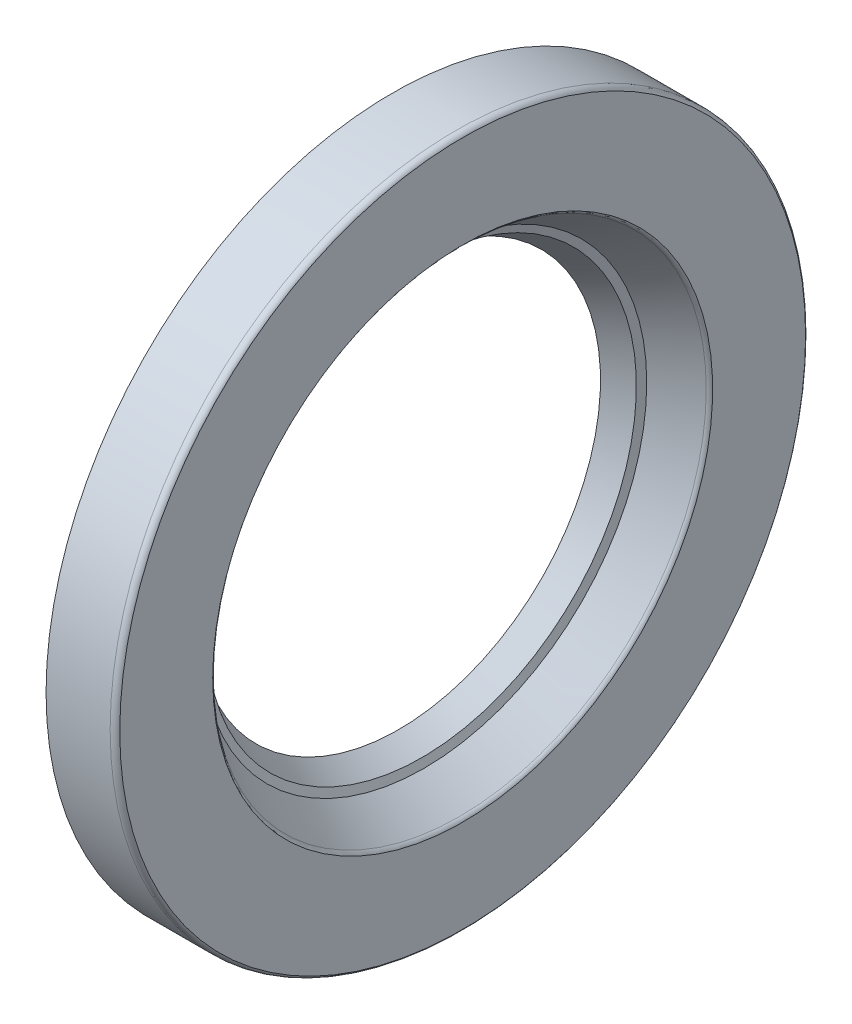
ISO-10303-21;
HEADER;
FILE_DESCRIPTION(('STEP AP214'),'2;1');
FILE_NAME('part.step','',(''),(''),'','','');
FILE_SCHEMA(('AUTOMOTIVE_DESIGN { 1 0 10303 214 1 1 1 1 }'));
ENDSEC;
DATA;
#1=APPLICATION_CONTEXT('core data for automotive mechanical design processes');
#2=APPLICATION_PROTOCOL_DEFINITION('international standard','automotive_design',2000,#1);
#3=PRODUCT_CONTEXT('',#1,'mechanical');
#4=PRODUCT('Part','Part','',(#3));
#5=PRODUCT_RELATED_PRODUCT_CATEGORY('part','',(#4));
#6=PRODUCT_DEFINITION_FORMATION('','',#4);
#7=PRODUCT_DEFINITION_CONTEXT('part definition',#1,'design');
#8=PRODUCT_DEFINITION('design','',#6,#7);
#9=PRODUCT_DEFINITION_SHAPE('','',#8);
#10=(LENGTH_UNIT() NAMED_UNIT(*) SI_UNIT(.MILLI.,.METRE.));
#11=(NAMED_UNIT(*) PLANE_ANGLE_UNIT() SI_UNIT($,.RADIAN.));
#12=(NAMED_UNIT(*) SI_UNIT($,.STERADIAN.) SOLID_ANGLE_UNIT());
#13=UNCERTAINTY_MEASURE_WITH_UNIT(LENGTH_MEASURE(1.E-05),#10,'distance_accuracy_value','');
#14=(GEOMETRIC_REPRESENTATION_CONTEXT(3) GLOBAL_UNCERTAINTY_ASSIGNED_CONTEXT((#13)) GLOBAL_UNIT_ASSIGNED_CONTEXT((#10,
#11,#12)) REPRESENTATION_CONTEXT('',''));
#15=CARTESIAN_POINT('',(0.,0.,0.));
#16=DIRECTION('',(0.,0.,1.));
#17=DIRECTION('',(1.,0.,0.));
#18=AXIS2_PLACEMENT_3D('',#15,#16,#17);
#19=CARTESIAN_POINT('',(0.,0.,0.));
#20=DIRECTION('',(-1.,0.,0.));
#21=DIRECTION('',(0.,0.,1.));
#22=AXIS2_PLACEMENT_3D('',#19,#20,#21);
#23=CYLINDRICAL_SURFACE('',#22,36.);
#24=CARTESIAN_POINT('',(7.33333333333333,0.,0.));
#25=DIRECTION('',(-1.,0.,0.));
#26=DIRECTION('',(0.,0.,1.));
#27=AXIS2_PLACEMENT_3D('',#24,#25,#26);
#28=CIRCLE('',#27,36.);
#29=CARTESIAN_POINT('',(7.33333333333333,0.,36.));
#30=VERTEX_POINT('',#29);
#31=EDGE_CURVE('E9',#30,#30,#28,.T.);
#32=ORIENTED_EDGE('',*,*,#31,.T.);
#33=EDGE_LOOP('',(#32));
#34=FACE_BOUND('',#33,.T.);
#35=CARTESIAN_POINT('',(0.666666666666667,0.,0.));
#36=DIRECTION('',(-1.,0.,0.));
#37=DIRECTION('',(0.,0.,1.));
#38=AXIS2_PLACEMENT_3D('',#35,#36,#37);
#39=CIRCLE('',#38,36.);
#40=CARTESIAN_POINT('',(0.666666666666667,0.,36.));
#41=VERTEX_POINT('',#40);
#42=EDGE_CURVE('E69',#41,#41,#39,.T.);
#43=ORIENTED_EDGE('',*,*,#42,.F.);
#44=EDGE_LOOP('',(#43));
#45=FACE_BOUND('',#44,.T.);
#46=ADVANCED_FACE('F14',(#34,#45),#23,.T.);
#47=CARTESIAN_POINT('',(7.41946005043015,0.,0.));
#48=DIRECTION('',(-1.,0.,0.));
#49=DIRECTION('',(0.,0.,1.));
#50=AXIS2_PLACEMENT_3D('',#47,#48,#49);
#51=TOROIDAL_SURFACE('',#50,35.3389201008603,0.666666666666667);
#52=ORIENTED_EDGE('',*,*,#31,.F.);
#53=EDGE_LOOP('',(#52));
#54=FACE_BOUND('',#53,.T.);
#55=CARTESIAN_POINT('',(8.,0.,0.));
#56=DIRECTION('',(-1.,0.,0.));
#57=DIRECTION('',(0.,0.,1.));
#58=AXIS2_PLACEMENT_3D('',#55,#56,#57);
#59=CIRCLE('',#58,35.6666666666667);
#60=CARTESIAN_POINT('',(8.,0.,35.6666666666667));
#61=VERTEX_POINT('',#60);
#62=EDGE_CURVE('E20',#61,#61,#59,.T.);
#63=ORIENTED_EDGE('',*,*,#62,.T.);
#64=EDGE_LOOP('',(#63));
#65=FACE_BOUND('',#64,.T.);
#66=ADVANCED_FACE('F77',(#54,#65),#51,.T.);
#67=CARTESIAN_POINT('',(8.,35.6666666666667,0.));
#68=DIRECTION('',(1.,0.,0.));
#69=DIRECTION('',(0.,0.,-1.));
#70=AXIS2_PLACEMENT_3D('',#67,#68,#69);
#71=PLANE('',#70);
#72=CARTESIAN_POINT('',(8.,0.,0.));
#73=DIRECTION('',(-1.,0.,0.));
#74=DIRECTION('',(0.,0.,1.));
#75=AXIS2_PLACEMENT_3D('',#72,#73,#74);
#76=CIRCLE('',#75,26.);
#77=CARTESIAN_POINT('',(8.,0.,26.));
#78=VERTEX_POINT('',#77);
#79=EDGE_CURVE('E24',#78,#78,#76,.T.);
#80=ORIENTED_EDGE('',*,*,#79,.T.);
#81=EDGE_LOOP('',(#80));
#82=FACE_BOUND('',#81,.T.);
#83=ORIENTED_EDGE('',*,*,#62,.F.);
#84=EDGE_LOOP('',(#83));
#85=FACE_BOUND('',#84,.T.);
#86=ADVANCED_FACE('F82',(#82,#85),#71,.T.);
#87=CARTESIAN_POINT('',(7.39237478148924,0.,0.));
#88=DIRECTION('',(-1.,0.,0.));
#89=DIRECTION('',(0.,0.,1.));
#90=AXIS2_PLACEMENT_3D('',#87,#88,#89);
#91=TOROIDAL_SURFACE('',#90,26.2742918851774,0.666666666666667);
#92=ORIENTED_EDGE('',*,*,#79,.F.);
#93=EDGE_LOOP('',(#92));
#94=FACE_BOUND('',#93,.T.);
#95=CARTESIAN_POINT('',(7.66666666666667,0.,0.));
#96=DIRECTION('',(-1.,0.,0.));
#97=DIRECTION('',(0.,0.,1.));
#98=AXIS2_PLACEMENT_3D('',#95,#96,#97);
#99=CIRCLE('',#98,25.6666666666667);
#100=CARTESIAN_POINT('',(7.66666666666667,0.,25.6666666666667));
#101=VERTEX_POINT('',#100);
#102=EDGE_CURVE('E28',#101,#101,#99,.T.);
#103=ORIENTED_EDGE('',*,*,#102,.T.);
#104=EDGE_LOOP('',(#103));
#105=FACE_BOUND('',#104,.T.);
#106=ADVANCED_FACE('F87',(#94,#105),#91,.T.);
#107=CARTESIAN_POINT('',(7.66666666666667,0.,0.));
#108=DIRECTION('',(1.,0.,0.));
#109=DIRECTION('',(0.,0.,-1.));
#110=AXIS2_PLACEMENT_3D('',#107,#108,#109);
#111=CONICAL_SURFACE('',#110,25.6666666666667,0.602838310266542);
#112=CARTESIAN_POINT('',(4.,0.,0.));
#113=DIRECTION('',(-1.,0.,0.));
#114=DIRECTION('',(0.,0.,1.));
#115=AXIS2_PLACEMENT_3D('',#112,#113,#114);
#116=CIRCLE('',#115,23.1428571428571);
#117=CARTESIAN_POINT('',(4.,0.,23.1428571428571));
#118=VERTEX_POINT('',#117);
#119=EDGE_CURVE('E33',#118,#118,#116,.T.);
#120=ORIENTED_EDGE('',*,*,#119,.T.);
#121=EDGE_LOOP('',(#120));
#122=FACE_BOUND('',#121,.T.);
#123=ORIENTED_EDGE('',*,*,#102,.F.);
#124=EDGE_LOOP('',(#123));
#125=FACE_BOUND('',#124,.T.);
#126=ADVANCED_FACE('F93',(#122,#125),#111,.F.);
#127=CARTESIAN_POINT('',(4.,0.,0.));
#128=DIRECTION('',(1.,0.,0.));
#129=DIRECTION('',(0.,0.,-1.));
#130=AXIS2_PLACEMENT_3D('',#127,#128,#129);
#131=CONICAL_SURFACE('',#130,23.1428571428571,1.25257932659612);
#132=CARTESIAN_POINT('',(3.73333333333334,0.,0.));
#133=DIRECTION('',(-1.,0.,0.));
#134=DIRECTION('',(0.,0.,1.));
#135=AXIS2_PLACEMENT_3D('',#132,#133,#134);
#136=CIRCLE('',#135,22.3333333333333);
#137=CARTESIAN_POINT('',(3.73333333333334,0.,22.3333333333333));
#138=VERTEX_POINT('',#137);
#139=EDGE_CURVE('E36',#138,#138,#136,.T.);
#140=ORIENTED_EDGE('',*,*,#139,.T.);
#141=EDGE_LOOP('',(#140));
#142=FACE_BOUND('',#141,.T.);
#143=ORIENTED_EDGE('',*,*,#119,.F.);
#144=EDGE_LOOP('',(#143));
#145=FACE_BOUND('',#144,.T.);
#146=ADVANCED_FACE('F97',(#142,#145),#131,.F.);
#147=CARTESIAN_POINT('',(3.73333333333334,0.,0.));
#148=DIRECTION('',(1.,0.,0.));
#149=DIRECTION('',(0.,0.,-1.));
#150=AXIS2_PLACEMENT_3D('',#147,#148,#149);
#151=CONICAL_SURFACE('',#150,22.3333333333333,0.507098504392337);
#152=CARTESIAN_POINT('',(1.33333333333333,0.,0.));
#153=DIRECTION('',(-1.,0.,0.));
#154=DIRECTION('',(0.,0.,1.));
#155=AXIS2_PLACEMENT_3D('',#152,#153,#154);
#156=CIRCLE('',#155,21.);
#157=CARTESIAN_POINT('',(1.33333333333333,0.,21.));
#158=VERTEX_POINT('',#157);
#159=EDGE_CURVE('E39',#158,#158,#156,.T.);
#160=ORIENTED_EDGE('',*,*,#159,.T.);
#161=EDGE_LOOP('',(#160));
#162=FACE_BOUND('',#161,.T.);
#163=ORIENTED_EDGE('',*,*,#139,.F.);
#164=EDGE_LOOP('',(#163));
#165=FACE_BOUND('',#164,.T.);
#166=ADVANCED_FACE('F101',(#162,#165),#151,.F.);
#167=CARTESIAN_POINT('',(1.33333333333333,0.,0.));
#168=DIRECTION('',(-1.,0.,0.));
#169=DIRECTION('',(0.,0.,1.));
#170=AXIS2_PLACEMENT_3D('',#167,#168,#169);
#171=CONICAL_SURFACE('',#170,21.,1.2134876437868);
#172=CARTESIAN_POINT('',(0.533333333333333,0.,0.));
#173=DIRECTION('',(-1.,0.,0.));
#174=DIRECTION('',(0.,0.,1.));
#175=AXIS2_PLACEMENT_3D('',#172,#173,#174);
#176=CIRCLE('',#175,23.1428571428571);
#177=CARTESIAN_POINT('',(0.533333333333333,0.,23.1428571428571));
#178=VERTEX_POINT('',#177);
#179=EDGE_CURVE('E42',#178,#178,#176,.T.);
#180=ORIENTED_EDGE('',*,*,#179,.T.);
#181=EDGE_LOOP('',(#180));
#182=FACE_BOUND('',#181,.T.);
#183=ORIENTED_EDGE('',*,*,#159,.F.);
#184=EDGE_LOOP('',(#183));
#185=FACE_BOUND('',#184,.T.);
#186=ADVANCED_FACE('F105',(#182,#185),#171,.F.);
#187=CARTESIAN_POINT('',(0.533333333333333,23.1428571428571,0.));
#188=DIRECTION('',(-1.,0.,0.));
#189=DIRECTION('',(0.,0.,1.));
#190=AXIS2_PLACEMENT_3D('',#187,#188,#189);
#191=PLANE('',#190);
#192=CARTESIAN_POINT('',(0.533333333333334,0.,0.));
#193=DIRECTION('',(-1.,0.,0.));
#194=DIRECTION('',(0.,0.,1.));
#195=AXIS2_PLACEMENT_3D('',#192,#193,#194);
#196=CIRCLE('',#195,25.9823757543867);
#197=CARTESIAN_POINT('',(0.533333333333334,0.,25.9823757543867));
#198=VERTEX_POINT('',#197);
#199=EDGE_CURVE('E45',#198,#198,#196,.T.);
#200=ORIENTED_EDGE('',*,*,#199,.T.);
#201=EDGE_LOOP('',(#200));
#202=FACE_BOUND('',#201,.T.);
#203=ORIENTED_EDGE('',*,*,#179,.F.);
#204=EDGE_LOOP('',(#203));
#205=FACE_BOUND('',#204,.T.);
#206=ADVANCED_FACE('F109',(#202,#205),#191,.T.);
#207=CARTESIAN_POINT('',(0.,0.,0.));
#208=DIRECTION('',(-1.,0.,0.));
#209=DIRECTION('',(0.,0.,1.));
#210=AXIS2_PLACEMENT_3D('',#207,#208,#209);
#211=CYLINDRICAL_SURFACE('',#210,25.9823757543867);
#212=CARTESIAN_POINT('',(1.40313318068433,0.,0.));
#213=DIRECTION('',(-1.,0.,0.));
#214=DIRECTION('',(0.,0.,1.));
#215=AXIS2_PLACEMENT_3D('',#212,#213,#214);
#216=CIRCLE('',#215,25.9823757543867);
#217=CARTESIAN_POINT('',(1.40313318068433,0.,25.9823757543867));
#218=VERTEX_POINT('',#217);
#219=EDGE_CURVE('E48',#218,#218,#216,.T.);
#220=ORIENTED_EDGE('',*,*,#219,.T.);
#221=EDGE_LOOP('',(#220));
#222=FACE_BOUND('',#221,.T.);
#223=ORIENTED_EDGE('',*,*,#199,.F.);
#224=EDGE_LOOP('',(#223));
#225=FACE_BOUND('',#224,.T.);
#226=ADVANCED_FACE('F113',(#222,#225),#211,.T.);
#227=CARTESIAN_POINT('',(2.,0.,0.));
#228=DIRECTION('',(-1.,0.,0.));
#229=DIRECTION('',(0.,0.,1.));
#230=AXIS2_PLACEMENT_3D('',#227,#228,#229);
#231=TOROIDAL_SURFACE('',#230,24.75,1.36930639376291);
#232=ORIENTED_EDGE('',*,*,#219,.F.);
#233=EDGE_LOOP('',(#232));
#234=FACE_BOUND('',#233,.T.);
#235=CARTESIAN_POINT('',(3.25036554080881,0.,0.));
#236=DIRECTION('',(-1.,0.,0.));
#237=DIRECTION('',(0.,0.,1.));
#238=AXIS2_PLACEMENT_3D('',#235,#236,#237);
#239=CIRCLE('',#238,25.3081989021468);
#240=CARTESIAN_POINT('',(3.25036554080881,0.,25.3081989021468));
#241=VERTEX_POINT('',#240);
#242=EDGE_CURVE('E51',#241,#241,#239,.T.);
#243=ORIENTED_EDGE('',*,*,#242,.T.);
#244=EDGE_LOOP('',(#243));
#245=FACE_BOUND('',#244,.T.);
#246=ADVANCED_FACE('F117',(#234,#245),#231,.T.);
#247=CARTESIAN_POINT('',(4.8,0.,0.));
#248=DIRECTION('',(1.,0.,0.));
#249=DIRECTION('',(0.,0.,-1.));
#250=AXIS2_PLACEMENT_3D('',#247,#248,#249);
#251=CONICAL_SURFACE('',#250,26.,0.419879957205552);
#252=ORIENTED_EDGE('',*,*,#242,.F.);
#253=EDGE_LOOP('',(#252));
#254=FACE_BOUND('',#253,.T.);
#255=CARTESIAN_POINT('',(4.8,0.,0.));
#256=DIRECTION('',(-1.,0.,0.));
#257=DIRECTION('',(0.,0.,1.));
#258=AXIS2_PLACEMENT_3D('',#255,#256,#257);
#259=CIRCLE('',#258,26.);
#260=CARTESIAN_POINT('',(4.8,0.,26.));
#261=VERTEX_POINT('',#260);
#262=EDGE_CURVE('E54',#261,#261,#259,.T.);
#263=ORIENTED_EDGE('',*,*,#262,.T.);
#264=EDGE_LOOP('',(#263));
#265=FACE_BOUND('',#264,.T.);
#266=ADVANCED_FACE('F121',(#254,#265),#251,.T.);
#267=CARTESIAN_POINT('',(4.8,31.9166666666667,0.));
#268=DIRECTION('',(1.,0.,0.));
#269=DIRECTION('',(0.,0.,-1.));
#270=AXIS2_PLACEMENT_3D('',#267,#268,#269);
#271=PLANE('',#270);
#272=ORIENTED_EDGE('',*,*,#262,.F.);
#273=EDGE_LOOP('',(#272));
#274=FACE_BOUND('',#273,.T.);
#275=CARTESIAN_POINT('',(4.8,0.,0.));
#276=DIRECTION('',(-1.,0.,0.));
#277=DIRECTION('',(0.,0.,1.));
#278=AXIS2_PLACEMENT_3D('',#275,#276,#277);
#279=CIRCLE('',#278,31.9166666666667);
#280=CARTESIAN_POINT('',(4.8,0.,31.9166666666667));
#281=VERTEX_POINT('',#280);
#282=EDGE_CURVE('E57',#281,#281,#279,.T.);
#283=ORIENTED_EDGE('',*,*,#282,.T.);
#284=EDGE_LOOP('',(#283));
#285=FACE_BOUND('',#284,.T.);
#286=ADVANCED_FACE('F125',(#274,#285),#271,.F.);
#287=CARTESIAN_POINT('',(4.19237478148924,0.,0.));
#288=DIRECTION('',(-1.,0.,0.));
#289=DIRECTION('',(0.,0.,1.));
#290=AXIS2_PLACEMENT_3D('',#287,#288,#289);
#291=TOROIDAL_SURFACE('',#290,31.6423747814893,0.666666666666667);
#292=CARTESIAN_POINT('',(4.46666666666667,0.,0.));
#293=DIRECTION('',(-1.,0.,0.));
#294=DIRECTION('',(0.,0.,1.));
#295=AXIS2_PLACEMENT_3D('',#292,#293,#294);
#296=CIRCLE('',#295,32.25);
#297=CARTESIAN_POINT('',(4.46666666666667,0.,32.25));
#298=VERTEX_POINT('',#297);
#299=EDGE_CURVE('E60',#298,#298,#296,.T.);
#300=ORIENTED_EDGE('',*,*,#299,.T.);
#301=EDGE_LOOP('',(#300));
#302=FACE_BOUND('',#301,.T.);
#303=ORIENTED_EDGE('',*,*,#282,.F.);
#304=EDGE_LOOP('',(#303));
#305=FACE_BOUND('',#304,.T.);
#306=ADVANCED_FACE('F129',(#302,#305),#291,.F.);
#307=CARTESIAN_POINT('',(0.,0.,0.));
#308=DIRECTION('',(-1.,0.,0.));
#309=DIRECTION('',(0.,0.,1.));
#310=AXIS2_PLACEMENT_3D('',#307,#308,#309);
#311=CONICAL_SURFACE('',#310,33.,0.166358598179334);
#312=ORIENTED_EDGE('',*,*,#299,.F.);
#313=EDGE_LOOP('',(#312));
#314=FACE_BOUND('',#313,.T.);
#315=CARTESIAN_POINT('',(0.,0.,0.));
#316=DIRECTION('',(-1.,0.,0.));
#317=DIRECTION('',(0.,0.,1.));
#318=AXIS2_PLACEMENT_3D('',#315,#316,#317);
#319=CIRCLE('',#318,33.);
#320=CARTESIAN_POINT('',(0.,0.,33.));
#321=VERTEX_POINT('',#320);
#322=EDGE_CURVE('E63',#321,#321,#319,.T.);
#323=ORIENTED_EDGE('',*,*,#322,.T.);
#324=EDGE_LOOP('',(#323));
#325=FACE_BOUND('',#324,.T.);
#326=ADVANCED_FACE('F133',(#314,#325),#311,.F.);
#327=CARTESIAN_POINT('',(0.,33.,0.));
#328=DIRECTION('',(-1.,0.,0.));
#329=DIRECTION('',(0.,0.,1.));
#330=AXIS2_PLACEMENT_3D('',#327,#328,#329);
#331=PLANE('',#330);
#332=CARTESIAN_POINT('',(0.,0.,0.));
#333=DIRECTION('',(-1.,0.,0.));
#334=DIRECTION('',(0.,0.,1.));
#335=AXIS2_PLACEMENT_3D('',#332,#333,#334);
#336=CIRCLE('',#335,34.75);
#337=CARTESIAN_POINT('',(0.,0.,34.75));
#338=VERTEX_POINT('',#337);
#339=EDGE_CURVE('E66',#338,#338,#336,.T.);
#340=ORIENTED_EDGE('',*,*,#339,.T.);
#341=EDGE_LOOP('',(#340));
#342=FACE_BOUND('',#341,.T.);
#343=ORIENTED_EDGE('',*,*,#322,.F.);
#344=EDGE_LOOP('',(#343));
#345=FACE_BOUND('',#344,.T.);
#346=ADVANCED_FACE('F137',(#342,#345),#331,.T.);
#347=CARTESIAN_POINT('',(0.,0.,0.));
#348=DIRECTION('',(1.,0.,0.));
#349=DIRECTION('',(0.,0.,-1.));
#350=AXIS2_PLACEMENT_3D('',#347,#348,#349);
#351=CONICAL_SURFACE('',#350,34.75,1.08083900054117);
#352=ORIENTED_EDGE('',*,*,#42,.T.);
#353=EDGE_LOOP('',(#352));
#354=FACE_BOUND('',#353,.T.);
#355=ORIENTED_EDGE('',*,*,#339,.F.);
#356=EDGE_LOOP('',(#355));
#357=FACE_BOUND('',#356,.T.);
#358=ADVANCED_FACE('F73',(#354,#357),#351,.T.);
#359=CLOSED_SHELL('',(#46,#66,#86,#106,#126,#146,#166,#186,#206,#226,#246,#266,#286,#306,#326,
#346,#358));
#360=MANIFOLD_SOLID_BREP('B1',#359);
#361=ADVANCED_BREP_SHAPE_REPRESENTATION('',(#18,#360),#14);
#362=SHAPE_DEFINITION_REPRESENTATION(#9,#361);
ENDSEC;
END-ISO-10303-21;
